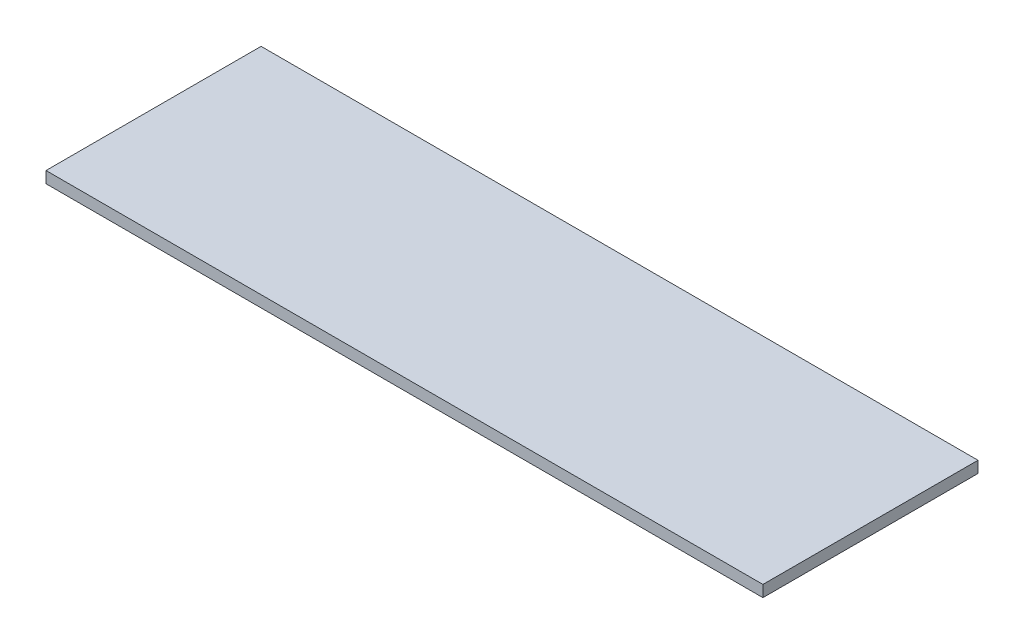
ISO-10303-21;
HEADER;
FILE_DESCRIPTION(('STEP AP214'),'2;1');
FILE_NAME('part.step','',(''),(''),'','','');
FILE_SCHEMA(('AUTOMOTIVE_DESIGN { 1 0 10303 214 1 1 1 1 }'));
ENDSEC;
DATA;
#1=APPLICATION_CONTEXT('core data for automotive mechanical design processes');
#2=APPLICATION_PROTOCOL_DEFINITION('international standard','automotive_design',2000,#1);
#3=PRODUCT_CONTEXT('',#1,'mechanical');
#4=PRODUCT('Part','Part','',(#3));
#5=PRODUCT_RELATED_PRODUCT_CATEGORY('part','',(#4));
#6=PRODUCT_DEFINITION_FORMATION('','',#4);
#7=PRODUCT_DEFINITION_CONTEXT('part definition',#1,'design');
#8=PRODUCT_DEFINITION('design','',#6,#7);
#9=PRODUCT_DEFINITION_SHAPE('','',#8);
#10=(LENGTH_UNIT() NAMED_UNIT(*) SI_UNIT(.MILLI.,.METRE.));
#11=(NAMED_UNIT(*) PLANE_ANGLE_UNIT() SI_UNIT($,.RADIAN.));
#12=(NAMED_UNIT(*) SI_UNIT($,.STERADIAN.) SOLID_ANGLE_UNIT());
#13=UNCERTAINTY_MEASURE_WITH_UNIT(LENGTH_MEASURE(1.E-05),#10,'distance_accuracy_value','');
#14=(GEOMETRIC_REPRESENTATION_CONTEXT(3) GLOBAL_UNCERTAINTY_ASSIGNED_CONTEXT((#13)) GLOBAL_UNIT_ASSIGNED_CONTEXT((#10,
#11,#12)) REPRESENTATION_CONTEXT('',''));
#15=CARTESIAN_POINT('',(0.,0.,0.));
#16=DIRECTION('',(0.,0.,1.));
#17=DIRECTION('',(1.,0.,0.));
#18=AXIS2_PLACEMENT_3D('',#15,#16,#17);
#19=CARTESIAN_POINT('',(50.,-1.6,-15.));
#20=DIRECTION('',(1.,0.,0.));
#21=DIRECTION('',(0.,0.,-1.));
#22=AXIS2_PLACEMENT_3D('',#19,#20,#21);
#23=PLANE('',#22);
#24=DIRECTION('',(0.,0.,-1.));
#25=VECTOR('',#24,1.);
#26=CARTESIAN_POINT('',(50.,0.,-15.));
#27=LINE('',#26,#25);
#28=CARTESIAN_POINT('',(50.,0.,15.));
#29=VERTEX_POINT('',#28);
#30=CARTESIAN_POINT('',(50.,0.,-15.));
#31=VERTEX_POINT('',#30);
#32=EDGE_CURVE('E97',#29,#31,#27,.T.);
#33=ORIENTED_EDGE('',*,*,#32,.F.);
#34=DIRECTION('',(0.,1.,0.));
#35=VECTOR('',#34,1.);
#36=CARTESIAN_POINT('',(50.,-1.6,15.));
#37=LINE('',#36,#35);
#38=CARTESIAN_POINT('',(50.,-1.6,15.));
#39=VERTEX_POINT('',#38);
#40=EDGE_CURVE('E11',#39,#29,#37,.T.);
#41=ORIENTED_EDGE('',*,*,#40,.F.);
#42=DIRECTION('',(0.,0.,-1.));
#43=VECTOR('',#42,1.);
#44=CARTESIAN_POINT('',(50.,-1.6,-15.));
#45=LINE('',#44,#43);
#46=CARTESIAN_POINT('',(50.,-1.6,-15.));
#47=VERTEX_POINT('',#46);
#48=EDGE_CURVE('E91',#39,#47,#45,.T.);
#49=ORIENTED_EDGE('',*,*,#48,.T.);
#50=DIRECTION('',(0.,1.,0.));
#51=VECTOR('',#50,1.);
#52=CARTESIAN_POINT('',(50.,-1.6,-15.));
#53=LINE('',#52,#51);
#54=EDGE_CURVE('E36',#47,#31,#53,.T.);
#55=ORIENTED_EDGE('',*,*,#54,.T.);
#56=EDGE_LOOP('',(#33,#41,#49,#55));
#57=FACE_BOUND('',#56,.T.);
#58=ADVANCED_FACE('F33',(#57),#23,.T.);
#59=CARTESIAN_POINT('',(-50.,-1.6,15.));
#60=DIRECTION('',(0.,0.,1.));
#61=DIRECTION('',(1.,0.,0.));
#62=AXIS2_PLACEMENT_3D('',#59,#60,#61);
#63=PLANE('',#62);
#64=DIRECTION('',(1.,0.,0.));
#65=VECTOR('',#64,1.);
#66=CARTESIAN_POINT('',(-50.,0.,15.));
#67=LINE('',#66,#65);
#68=CARTESIAN_POINT('',(-50.,0.,15.));
#69=VERTEX_POINT('',#68);
#70=EDGE_CURVE('E93',#69,#29,#67,.T.);
#71=ORIENTED_EDGE('',*,*,#70,.F.);
#72=DIRECTION('',(0.,1.,0.));
#73=VECTOR('',#72,1.);
#74=CARTESIAN_POINT('',(-50.,-1.6,15.));
#75=LINE('',#74,#73);
#76=CARTESIAN_POINT('',(-50.,-1.6,15.));
#77=VERTEX_POINT('',#76);
#78=EDGE_CURVE('E42',#77,#69,#75,.T.);
#79=ORIENTED_EDGE('',*,*,#78,.F.);
#80=DIRECTION('',(1.,0.,0.));
#81=VECTOR('',#80,1.);
#82=CARTESIAN_POINT('',(-50.,-1.6,15.));
#83=LINE('',#82,#81);
#84=EDGE_CURVE('E88',#77,#39,#83,.T.);
#85=ORIENTED_EDGE('',*,*,#84,.T.);
#86=ORIENTED_EDGE('',*,*,#40,.T.);
#87=EDGE_LOOP('',(#71,#79,#85,#86));
#88=FACE_BOUND('',#87,.T.);
#89=ADVANCED_FACE('F107',(#88),#63,.T.);
#90=CARTESIAN_POINT('',(-50.,-1.6,-15.));
#91=DIRECTION('',(-1.,0.,0.));
#92=DIRECTION('',(0.,0.,1.));
#93=AXIS2_PLACEMENT_3D('',#90,#91,#92);
#94=PLANE('',#93);
#95=DIRECTION('',(0.,0.,1.));
#96=VECTOR('',#95,1.);
#97=CARTESIAN_POINT('',(-50.,0.,-15.));
#98=LINE('',#97,#96);
#99=CARTESIAN_POINT('',(-50.,0.,-15.));
#100=VERTEX_POINT('',#99);
#101=EDGE_CURVE('E83',#100,#69,#98,.T.);
#102=ORIENTED_EDGE('',*,*,#101,.F.);
#103=DIRECTION('',(0.,1.,0.));
#104=VECTOR('',#103,1.);
#105=CARTESIAN_POINT('',(-50.,-1.6,-15.));
#106=LINE('',#105,#104);
#107=CARTESIAN_POINT('',(-50.,-1.6,-15.));
#108=VERTEX_POINT('',#107);
#109=EDGE_CURVE('E78',#108,#100,#106,.T.);
#110=ORIENTED_EDGE('',*,*,#109,.F.);
#111=DIRECTION('',(0.,0.,1.));
#112=VECTOR('',#111,1.);
#113=CARTESIAN_POINT('',(-50.,-1.6,-15.));
#114=LINE('',#113,#112);
#115=EDGE_CURVE('E81',#108,#77,#114,.T.);
#116=ORIENTED_EDGE('',*,*,#115,.T.);
#117=ORIENTED_EDGE('',*,*,#78,.T.);
#118=EDGE_LOOP('',(#102,#110,#116,#117));
#119=FACE_BOUND('',#118,.T.);
#120=ADVANCED_FACE('F80',(#119),#94,.T.);
#121=CARTESIAN_POINT('',(-50.,-1.6,-15.));
#122=DIRECTION('',(0.,0.,-1.));
#123=DIRECTION('',(-1.,0.,0.));
#124=AXIS2_PLACEMENT_3D('',#121,#122,#123);
#125=PLANE('',#124);
#126=DIRECTION('',(-1.,0.,0.));
#127=VECTOR('',#126,1.);
#128=CARTESIAN_POINT('',(-50.,0.,-15.));
#129=LINE('',#128,#127);
#130=EDGE_CURVE('E100',#31,#100,#129,.T.);
#131=ORIENTED_EDGE('',*,*,#130,.F.);
#132=ORIENTED_EDGE('',*,*,#54,.F.);
#133=DIRECTION('',(-1.,0.,0.));
#134=VECTOR('',#133,1.);
#135=CARTESIAN_POINT('',(-50.,-1.6,-15.));
#136=LINE('',#135,#134);
#137=EDGE_CURVE('E87',#47,#108,#136,.T.);
#138=ORIENTED_EDGE('',*,*,#137,.T.);
#139=ORIENTED_EDGE('',*,*,#109,.T.);
#140=EDGE_LOOP('',(#131,#132,#138,#139));
#141=FACE_BOUND('',#140,.T.);
#142=ADVANCED_FACE('F90',(#141),#125,.T.);
#143=CARTESIAN_POINT('',(0.,-1.6,0.));
#144=DIRECTION('',(0.,1.,0.));
#145=DIRECTION('',(0.,0.,1.));
#146=AXIS2_PLACEMENT_3D('',#143,#144,#145);
#147=PLANE('',#146);
#148=ORIENTED_EDGE('',*,*,#48,.F.);
#149=ORIENTED_EDGE('',*,*,#84,.F.);
#150=ORIENTED_EDGE('',*,*,#115,.F.);
#151=ORIENTED_EDGE('',*,*,#137,.F.);
#152=EDGE_LOOP('',(#148,#149,#150,#151));
#153=FACE_BOUND('',#152,.T.);
#154=ADVANCED_FACE('F86',(#153),#147,.F.);
#155=CARTESIAN_POINT('',(0.,0.,0.));
#156=DIRECTION('',(0.,1.,0.));
#157=DIRECTION('',(0.,0.,1.));
#158=AXIS2_PLACEMENT_3D('',#155,#156,#157);
#159=PLANE('',#158);
#160=ORIENTED_EDGE('',*,*,#32,.T.);
#161=ORIENTED_EDGE('',*,*,#130,.T.);
#162=ORIENTED_EDGE('',*,*,#101,.T.);
#163=ORIENTED_EDGE('',*,*,#70,.T.);
#164=EDGE_LOOP('',(#160,#161,#162,#163));
#165=FACE_BOUND('',#164,.T.);
#166=ADVANCED_FACE('F106',(#165),#159,.T.);
#167=CLOSED_SHELL('',(#58,#89,#120,#142,#154,#166));
#168=MANIFOLD_SOLID_BREP('B2',#167);
#169=ADVANCED_BREP_SHAPE_REPRESENTATION('',(#18,#168),#14);
#170=SHAPE_DEFINITION_REPRESENTATION(#9,#169);
ENDSEC;
END-ISO-10303-21;
